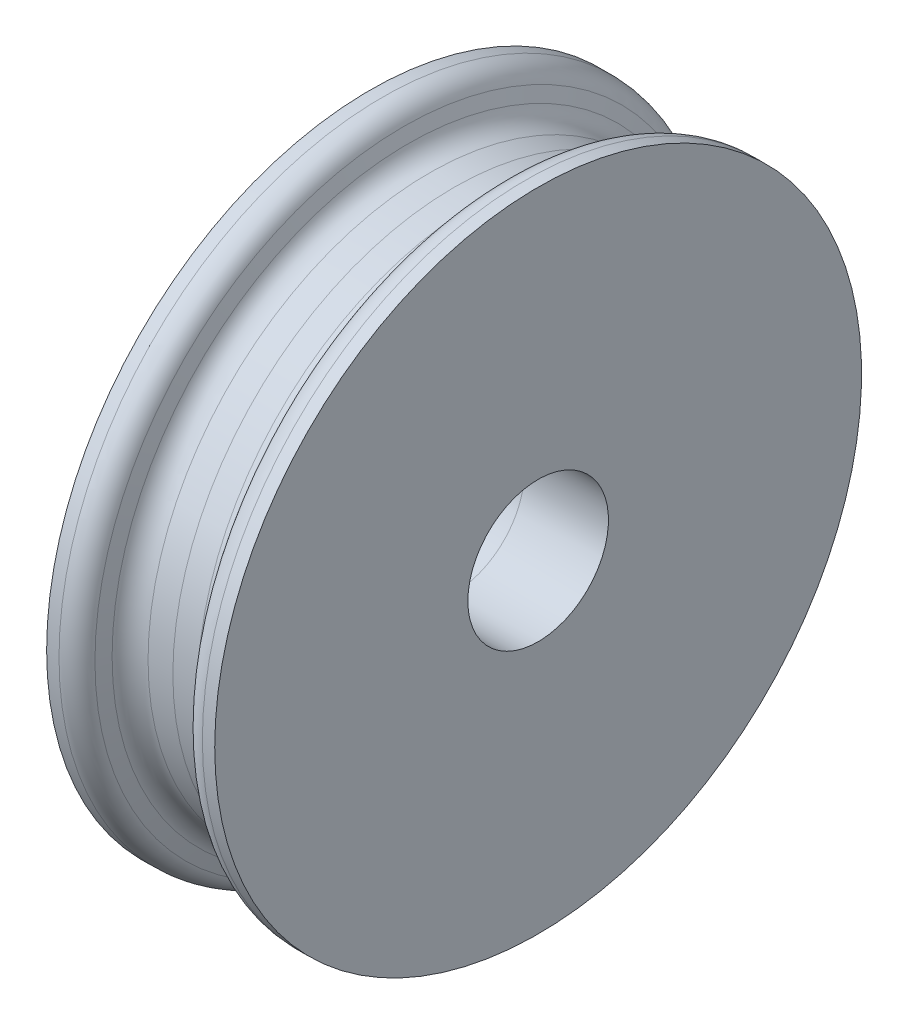
ISO-10303-21;
HEADER;
FILE_DESCRIPTION(('STEP AP214'),'2;1');
FILE_NAME('part.step','',(''),(''),'','','');
FILE_SCHEMA(('AUTOMOTIVE_DESIGN { 1 0 10303 214 1 1 1 1 }'));
ENDSEC;
DATA;
#1=APPLICATION_CONTEXT('core data for automotive mechanical design processes');
#2=APPLICATION_PROTOCOL_DEFINITION('international standard','automotive_design',2000,#1);
#3=PRODUCT_CONTEXT('',#1,'mechanical');
#4=PRODUCT('Part','Part','',(#3));
#5=PRODUCT_RELATED_PRODUCT_CATEGORY('part','',(#4));
#6=PRODUCT_DEFINITION_FORMATION('','',#4);
#7=PRODUCT_DEFINITION_CONTEXT('part definition',#1,'design');
#8=PRODUCT_DEFINITION('design','',#6,#7);
#9=PRODUCT_DEFINITION_SHAPE('','',#8);
#10=(LENGTH_UNIT() NAMED_UNIT(*) SI_UNIT(.MILLI.,.METRE.));
#11=(NAMED_UNIT(*) PLANE_ANGLE_UNIT() SI_UNIT($,.RADIAN.));
#12=(NAMED_UNIT(*) SI_UNIT($,.STERADIAN.) SOLID_ANGLE_UNIT());
#13=UNCERTAINTY_MEASURE_WITH_UNIT(LENGTH_MEASURE(1.E-05),#10,'distance_accuracy_value','');
#14=(GEOMETRIC_REPRESENTATION_CONTEXT(3) GLOBAL_UNCERTAINTY_ASSIGNED_CONTEXT((#13)) GLOBAL_UNIT_ASSIGNED_CONTEXT((#10,
#11,#12)) REPRESENTATION_CONTEXT('',''));
#15=CARTESIAN_POINT('',(0.,0.,0.));
#16=DIRECTION('',(0.,0.,1.));
#17=DIRECTION('',(1.,0.,0.));
#18=AXIS2_PLACEMENT_3D('',#15,#16,#17);
#19=CARTESIAN_POINT('',(12.6632000000032,0.,0.));
#20=DIRECTION('',(1.,0.,0.));
#21=DIRECTION('',(0.,0.,-1.));
#22=AXIS2_PLACEMENT_3D('',#19,#20,#21);
#23=PLANE('',#22);
#24=CARTESIAN_POINT('',(12.6632000000032,0.,0.));
#25=DIRECTION('',(1.,0.,0.));
#26=DIRECTION('',(0.,0.,-1.));
#27=AXIS2_PLACEMENT_3D('',#24,#25,#26);
#28=CIRCLE('',#27,31.75);
#29=CARTESIAN_POINT('',(12.6632000000032,0.,-31.75));
#30=VERTEX_POINT('',#29);
#31=EDGE_CURVE('E61',#30,#30,#28,.T.);
#32=ORIENTED_EDGE('',*,*,#31,.T.);
#33=EDGE_LOOP('',(#32));
#34=FACE_BOUND('',#33,.T.);
#35=CARTESIAN_POINT('',(12.6632000000032,0.,0.));
#36=DIRECTION('',(1.,0.,0.));
#37=DIRECTION('',(0.,0.,-1.));
#38=AXIS2_PLACEMENT_3D('',#35,#36,#37);
#39=CIRCLE('',#38,7.9375);
#40=CARTESIAN_POINT('',(12.6632000000032,0.,-7.9375));
#41=VERTEX_POINT('',#40);
#42=EDGE_CURVE('E49',#41,#41,#39,.F.);
#43=ORIENTED_EDGE('',*,*,#42,.T.);
#44=EDGE_LOOP('',(#43));
#45=FACE_BOUND('',#44,.T.);
#46=ADVANCED_FACE('F45',(#34,#45),#23,.T.);
#47=CARTESIAN_POINT('',(-22.1514000000065,0.,0.));
#48=DIRECTION('',(-1.,0.,0.));
#49=DIRECTION('',(0.,0.,1.));
#50=AXIS2_PLACEMENT_3D('',#47,#48,#49);
#51=CYLINDRICAL_SURFACE('',#50,31.75);
#52=CARTESIAN_POINT('',(9.86193538774544,0.,0.));
#53=DIRECTION('',(-1.,0.,0.));
#54=DIRECTION('',(0.,0.,1.));
#55=AXIS2_PLACEMENT_3D('',#52,#53,#54);
#56=CIRCLE('',#55,31.75);
#57=CARTESIAN_POINT('',(9.86193538774544,0.,31.75));
#58=VERTEX_POINT('',#57);
#59=EDGE_CURVE('E63',#58,#58,#56,.F.);
#60=ORIENTED_EDGE('',*,*,#59,.T.);
#61=EDGE_LOOP('',(#60));
#62=FACE_BOUND('',#61,.T.);
#63=ORIENTED_EDGE('',*,*,#31,.F.);
#64=EDGE_LOOP('',(#63));
#65=FACE_BOUND('',#64,.T.);
#66=ADVANCED_FACE('F47',(#62,#65),#51,.T.);
#67=CARTESIAN_POINT('',(-22.1514000000065,0.,0.));
#68=DIRECTION('',(-1.,0.,0.));
#69=DIRECTION('',(0.,0.,1.));
#70=AXIS2_PLACEMENT_3D('',#67,#68,#69);
#71=CYLINDRICAL_SURFACE('',#70,7.9375);
#72=CARTESIAN_POINT('',(3.175,0.,0.));
#73=DIRECTION('',(-1.,0.,0.));
#74=DIRECTION('',(0.,0.,1.));
#75=AXIS2_PLACEMENT_3D('',#72,#73,#74);
#76=CIRCLE('',#75,7.9375);
#77=CARTESIAN_POINT('',(3.175,0.,7.9375));
#78=VERTEX_POINT('',#77);
#79=EDGE_CURVE('E12',#78,#78,#76,.T.);
#80=ORIENTED_EDGE('',*,*,#79,.T.);
#81=EDGE_LOOP('',(#80));
#82=FACE_BOUND('',#81,.T.);
#83=ORIENTED_EDGE('',*,*,#42,.F.);
#84=EDGE_LOOP('',(#83));
#85=FACE_BOUND('',#84,.T.);
#86=ADVANCED_FACE('F73',(#82,#85),#71,.F.);
#87=CARTESIAN_POINT('',(8.08340824069277,0.,0.));
#88=DIRECTION('',(-1.,0.,0.));
#89=DIRECTION('',(0.,0.,1.));
#90=AXIS2_PLACEMENT_3D('',#87,#88,#89);
#91=CONICAL_SURFACE('',#90,31.75,1.22173047639603);
#92=CARTESIAN_POINT('',(6.95829210974354,0.,0.));
#93=DIRECTION('',(1.,0.,0.));
#94=DIRECTION('',(0.,0.,-1.));
#95=AXIS2_PLACEMENT_3D('',#92,#93,#94);
#96=CIRCLE('',#95,34.8412311640472);
#97=CARTESIAN_POINT('',(6.95829210974354,0.,-34.8412311640472));
#98=VERTEX_POINT('',#97);
#99=EDGE_CURVE('E67',#98,#98,#96,.T.);
#100=ORIENTED_EDGE('',*,*,#99,.T.);
#101=EDGE_LOOP('',(#100));
#102=FACE_BOUND('',#101,.T.);
#103=CARTESIAN_POINT('',(7.47511613094924,0.,0.));
#104=DIRECTION('',(-1.,0.,0.));
#105=DIRECTION('',(0.,0.,1.));
#106=AXIS2_PLACEMENT_3D('',#103,#104,#105);
#107=CIRCLE('',#106,33.4212688359528);
#108=CARTESIAN_POINT('',(7.47511613094924,0.,33.4212688359528));
#109=VERTEX_POINT('',#108);
#110=EDGE_CURVE('E107',#109,#109,#107,.T.);
#111=ORIENTED_EDGE('',*,*,#110,.T.);
#112=EDGE_LOOP('',(#111));
#113=FACE_BOUND('',#112,.T.);
#114=ADVANCED_FACE('F75',(#102,#113),#91,.T.);
#115=CARTESIAN_POINT('',(-22.1514000000065,0.,0.));
#116=DIRECTION('',(-1.,0.,0.));
#117=DIRECTION('',(0.,0.,1.));
#118=AXIS2_PLACEMENT_3D('',#115,#116,#117);
#119=CYLINDRICAL_SURFACE('',#118,36.5125);
#120=CARTESIAN_POINT('',(4.57147285294733,0.,0.));
#121=DIRECTION('',(1.,0.,0.));
#122=DIRECTION('',(0.,0.,-1.));
#123=AXIS2_PLACEMENT_3D('',#120,#121,#122);
#124=CIRCLE('',#123,36.5125);
#125=CARTESIAN_POINT('',(4.57147285294733,0.,-36.5125));
#126=VERTEX_POINT('',#125);
#127=EDGE_CURVE('E58',#126,#126,#124,.F.);
#128=ORIENTED_EDGE('',*,*,#127,.T.);
#129=EDGE_LOOP('',(#128));
#130=FACE_BOUND('',#129,.T.);
#131=CARTESIAN_POINT('',(3.175,0.,0.));
#132=DIRECTION('',(-1.,0.,0.));
#133=DIRECTION('',(0.,0.,1.));
#134=AXIS2_PLACEMENT_3D('',#131,#132,#133);
#135=CIRCLE('',#134,36.5125);
#136=CARTESIAN_POINT('',(3.175,0.,36.5125));
#137=VERTEX_POINT('',#136);
#138=EDGE_CURVE('E53',#137,#137,#135,.T.);
#139=ORIENTED_EDGE('',*,*,#138,.F.);
#140=EDGE_LOOP('',(#139));
#141=FACE_BOUND('',#140,.T.);
#142=ADVANCED_FACE('F80',(#130,#141),#119,.T.);
#143=CARTESIAN_POINT('',(3.175,7.9375,0.));
#144=DIRECTION('',(1.,0.,0.));
#145=DIRECTION('',(0.,0.,-1.));
#146=AXIS2_PLACEMENT_3D('',#143,#144,#145);
#147=PLANE('',#146);
#148=ORIENTED_EDGE('',*,*,#79,.F.);
#149=EDGE_LOOP('',(#148));
#150=FACE_BOUND('',#149,.T.);
#151=ORIENTED_EDGE('',*,*,#138,.T.);
#152=EDGE_LOOP('',(#151));
#153=FACE_BOUND('',#152,.T.);
#154=ADVANCED_FACE('F88',(#150,#153),#147,.F.);
#155=CARTESIAN_POINT('',(4.57147285294733,0.,0.));
#156=DIRECTION('',(1.,0.,0.));
#157=DIRECTION('',(0.,0.,-1.));
#158=AXIS2_PLACEMENT_3D('',#155,#156,#157);
#159=TOROIDAL_SURFACE('',#158,33.9725,2.54);
#160=ORIENTED_EDGE('',*,*,#99,.F.);
#161=EDGE_LOOP('',(#160));
#162=FACE_BOUND('',#161,.T.);
#163=ORIENTED_EDGE('',*,*,#127,.F.);
#164=EDGE_LOOP('',(#163));
#165=FACE_BOUND('',#164,.T.);
#166=ADVANCED_FACE('F91',(#162,#165),#159,.T.);
#167=CARTESIAN_POINT('',(9.86193538774544,0.,0.));
#168=DIRECTION('',(-1.,0.,0.));
#169=DIRECTION('',(0.,0.,1.));
#170=AXIS2_PLACEMENT_3D('',#167,#168,#169);
#171=TOROIDAL_SURFACE('',#170,34.29,2.54);
#172=ORIENTED_EDGE('',*,*,#59,.F.);
#173=EDGE_LOOP('',(#172));
#174=FACE_BOUND('',#173,.T.);
#175=ORIENTED_EDGE('',*,*,#110,.F.);
#176=EDGE_LOOP('',(#175));
#177=FACE_BOUND('',#176,.T.);
#178=ADVANCED_FACE('F87',(#174,#177),#171,.F.);
#179=CLOSED_SHELL('',(#46,#66,#86,#114,#142,#154,#166,#178));
#180=MANIFOLD_SOLID_BREP('B2',#179);
#181=CARTESIAN_POINT('',(12.6632000000032,0.,0.));
#182=DIRECTION('',(1.,0.,0.));
#183=DIRECTION('',(0.,0.,-1.));
#184=AXIS2_PLACEMENT_3D('',#181,#182,#183);
#185=PLANE('',#184);
#186=CARTESIAN_POINT('',(12.6632000000032,0.,0.));
#187=DIRECTION('',(1.,0.,0.));
#188=DIRECTION('',(0.,0.,-1.));
#189=AXIS2_PLACEMENT_3D('',#186,#187,#188);
#190=CIRCLE('',#189,7.9375);
#191=CARTESIAN_POINT('',(12.6632000000032,0.,-7.9375));
#192=VERTEX_POINT('',#191);
#193=EDGE_CURVE('E172',#192,#192,#190,.F.);
#194=ORIENTED_EDGE('',*,*,#193,.F.);
#195=EDGE_LOOP('',(#194));
#196=FACE_BOUND('',#195,.T.);
#197=CARTESIAN_POINT('',(12.6632000000032,0.,0.));
#198=DIRECTION('',(1.,0.,0.));
#199=DIRECTION('',(0.,0.,-1.));
#200=AXIS2_PLACEMENT_3D('',#197,#198,#199);
#201=CIRCLE('',#200,31.75);
#202=CARTESIAN_POINT('',(12.6632000000032,0.,-31.75));
#203=VERTEX_POINT('',#202);
#204=EDGE_CURVE('E44',#203,#203,#201,.T.);
#205=ORIENTED_EDGE('',*,*,#204,.F.);
#206=EDGE_LOOP('',(#205));
#207=FACE_BOUND('',#206,.T.);
#208=ADVANCED_FACE('F166',(#196,#207),#185,.F.);
#209=CARTESIAN_POINT('',(20.7549271470591,0.,0.));
#210=DIRECTION('',(1.,0.,0.));
#211=DIRECTION('',(0.,0.,-1.));
#212=AXIS2_PLACEMENT_3D('',#209,#210,#211);
#213=TOROIDAL_SURFACE('',#212,33.9725,2.54);
#214=CARTESIAN_POINT('',(20.7549271470591,0.,0.));
#215=DIRECTION('',(1.,0.,0.));
#216=DIRECTION('',(0.,0.,-1.));
#217=AXIS2_PLACEMENT_3D('',#214,#215,#216);
#218=CIRCLE('',#217,36.5125);
#219=CARTESIAN_POINT('',(20.7549271470591,0.,-36.5125));
#220=VERTEX_POINT('',#219);
#221=EDGE_CURVE('E180',#220,#220,#218,.T.);
#222=ORIENTED_EDGE('',*,*,#221,.F.);
#223=EDGE_LOOP('',(#222));
#224=FACE_BOUND('',#223,.T.);
#225=CARTESIAN_POINT('',(18.3681078902629,0.,0.));
#226=DIRECTION('',(-1.,0.,0.));
#227=DIRECTION('',(0.,0.,1.));
#228=AXIS2_PLACEMENT_3D('',#225,#226,#227);
#229=CIRCLE('',#228,34.8412311640472);
#230=CARTESIAN_POINT('',(18.3681078902629,0.,34.8412311640472));
#231=VERTEX_POINT('',#230);
#232=EDGE_CURVE('E185',#231,#231,#229,.T.);
#233=ORIENTED_EDGE('',*,*,#232,.F.);
#234=EDGE_LOOP('',(#233));
#235=FACE_BOUND('',#234,.T.);
#236=ADVANCED_FACE('F218',(#224,#235),#213,.T.);
#237=CARTESIAN_POINT('',(-22.1514000000065,0.,0.));
#238=DIRECTION('',(-1.,0.,0.));
#239=DIRECTION('',(0.,0.,1.));
#240=AXIS2_PLACEMENT_3D('',#237,#238,#239);
#241=CYLINDRICAL_SURFACE('',#240,36.5125);
#242=ORIENTED_EDGE('',*,*,#221,.T.);
#243=EDGE_LOOP('',(#242));
#244=FACE_BOUND('',#243,.T.);
#245=CARTESIAN_POINT('',(22.1514000000065,0.,0.));
#246=DIRECTION('',(-1.,0.,0.));
#247=DIRECTION('',(0.,0.,1.));
#248=AXIS2_PLACEMENT_3D('',#245,#246,#247);
#249=CIRCLE('',#248,36.5125);
#250=CARTESIAN_POINT('',(22.1514000000065,0.,36.5125));
#251=VERTEX_POINT('',#250);
#252=EDGE_CURVE('E191',#251,#251,#249,.T.);
#253=ORIENTED_EDGE('',*,*,#252,.T.);
#254=EDGE_LOOP('',(#253));
#255=FACE_BOUND('',#254,.T.);
#256=ADVANCED_FACE('F213',(#244,#255),#241,.T.);
#257=CARTESIAN_POINT('',(22.1514000000065,7.9375,0.));
#258=DIRECTION('',(-1.,0.,0.));
#259=DIRECTION('',(0.,0.,1.));
#260=AXIS2_PLACEMENT_3D('',#257,#258,#259);
#261=PLANE('',#260);
#262=ORIENTED_EDGE('',*,*,#252,.F.);
#263=EDGE_LOOP('',(#262));
#264=FACE_BOUND('',#263,.T.);
#265=CARTESIAN_POINT('',(22.1514000000065,0.,0.));
#266=DIRECTION('',(-1.,0.,0.));
#267=DIRECTION('',(0.,0.,1.));
#268=AXIS2_PLACEMENT_3D('',#265,#266,#267);
#269=CIRCLE('',#268,7.9375);
#270=CARTESIAN_POINT('',(22.1514000000065,0.,7.9375));
#271=VERTEX_POINT('',#270);
#272=EDGE_CURVE('E194',#271,#271,#269,.T.);
#273=ORIENTED_EDGE('',*,*,#272,.T.);
#274=EDGE_LOOP('',(#273));
#275=FACE_BOUND('',#274,.T.);
#276=ADVANCED_FACE('F198',(#264,#275),#261,.F.);
#277=CARTESIAN_POINT('',(-22.1514000000065,0.,0.));
#278=DIRECTION('',(-1.,0.,0.));
#279=DIRECTION('',(0.,0.,1.));
#280=AXIS2_PLACEMENT_3D('',#277,#278,#279);
#281=CYLINDRICAL_SURFACE('',#280,7.9375);
#282=ORIENTED_EDGE('',*,*,#193,.T.);
#283=EDGE_LOOP('',(#282));
#284=FACE_BOUND('',#283,.T.);
#285=ORIENTED_EDGE('',*,*,#272,.F.);
#286=EDGE_LOOP('',(#285));
#287=FACE_BOUND('',#286,.T.);
#288=ADVANCED_FACE('F200',(#284,#287),#281,.F.);
#289=CARTESIAN_POINT('',(18.9764000000065,0.,0.));
#290=DIRECTION('',(1.,0.,0.));
#291=DIRECTION('',(0.,0.,-1.));
#292=AXIS2_PLACEMENT_3D('',#289,#290,#291);
#293=CONICAL_SURFACE('',#292,36.5125,1.22173047639603);
#294=ORIENTED_EDGE('',*,*,#232,.T.);
#295=EDGE_LOOP('',(#294));
#296=FACE_BOUND('',#295,.T.);
#297=CARTESIAN_POINT('',(17.8512838690572,0.,0.));
#298=DIRECTION('',(1.,0.,0.));
#299=DIRECTION('',(0.,0.,-1.));
#300=AXIS2_PLACEMENT_3D('',#297,#298,#299);
#301=CIRCLE('',#300,33.4212688359528);
#302=CARTESIAN_POINT('',(17.8512838690572,0.,-33.4212688359528));
#303=VERTEX_POINT('',#302);
#304=EDGE_CURVE('E188',#303,#303,#301,.T.);
#305=ORIENTED_EDGE('',*,*,#304,.T.);
#306=EDGE_LOOP('',(#305));
#307=FACE_BOUND('',#306,.T.);
#308=ADVANCED_FACE('F202',(#296,#307),#293,.T.);
#309=CARTESIAN_POINT('',(15.464464612261,0.,0.));
#310=DIRECTION('',(-1.,0.,0.));
#311=DIRECTION('',(0.,0.,1.));
#312=AXIS2_PLACEMENT_3D('',#309,#310,#311);
#313=TOROIDAL_SURFACE('',#312,34.29,2.54);
#314=ORIENTED_EDGE('',*,*,#304,.F.);
#315=EDGE_LOOP('',(#314));
#316=FACE_BOUND('',#315,.T.);
#317=CARTESIAN_POINT('',(15.464464612261,0.,0.));
#318=DIRECTION('',(-1.,0.,0.));
#319=DIRECTION('',(0.,0.,1.));
#320=AXIS2_PLACEMENT_3D('',#317,#318,#319);
#321=CIRCLE('',#320,31.75);
#322=CARTESIAN_POINT('',(15.464464612261,0.,31.75));
#323=VERTEX_POINT('',#322);
#324=EDGE_CURVE('E176',#323,#323,#321,.T.);
#325=ORIENTED_EDGE('',*,*,#324,.F.);
#326=EDGE_LOOP('',(#325));
#327=FACE_BOUND('',#326,.T.);
#328=ADVANCED_FACE('F209',(#316,#327),#313,.F.);
#329=CARTESIAN_POINT('',(-22.1514000000065,0.,0.));
#330=DIRECTION('',(-1.,0.,0.));
#331=DIRECTION('',(0.,0.,1.));
#332=AXIS2_PLACEMENT_3D('',#329,#330,#331);
#333=CYLINDRICAL_SURFACE('',#332,31.75);
#334=ORIENTED_EDGE('',*,*,#204,.T.);
#335=EDGE_LOOP('',(#334));
#336=FACE_BOUND('',#335,.T.);
#337=ORIENTED_EDGE('',*,*,#324,.T.);
#338=EDGE_LOOP('',(#337));
#339=FACE_BOUND('',#338,.T.);
#340=ADVANCED_FACE('F220',(#336,#339),#333,.T.);
#341=CLOSED_SHELL('',(#208,#236,#256,#276,#288,#308,#328,#340));
#342=MANIFOLD_SOLID_BREP('B7',#341);
#343=ADVANCED_BREP_SHAPE_REPRESENTATION('',(#18,#180,#342),#14);
#344=SHAPE_DEFINITION_REPRESENTATION(#9,#343);
ENDSEC;
END-ISO-10303-21;
